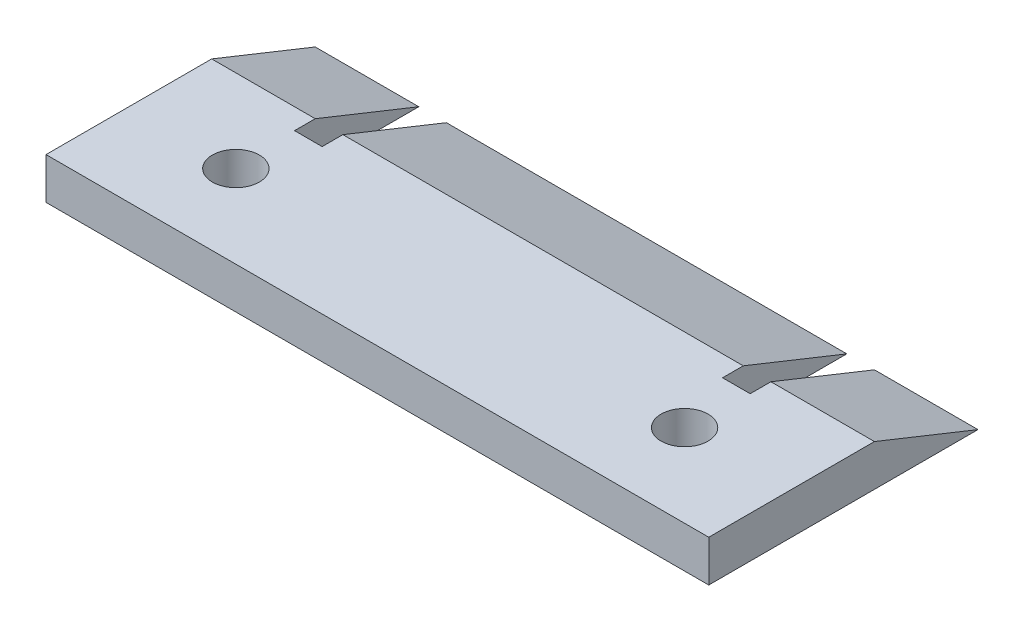
ISO-10303-21;
HEADER;
FILE_DESCRIPTION(('STEP AP214'),'2;1');
FILE_NAME('part.step','',(''),(''),'','','');
FILE_SCHEMA(('AUTOMOTIVE_DESIGN { 1 0 10303 214 1 1 1 1 }'));
ENDSEC;
DATA;
#1=APPLICATION_CONTEXT('core data for automotive mechanical design processes');
#2=APPLICATION_PROTOCOL_DEFINITION('international standard','automotive_design',2000,#1);
#3=PRODUCT_CONTEXT('',#1,'mechanical');
#4=PRODUCT('Part','Part','',(#3));
#5=PRODUCT_RELATED_PRODUCT_CATEGORY('part','',(#4));
#6=PRODUCT_DEFINITION_FORMATION('','',#4);
#7=PRODUCT_DEFINITION_CONTEXT('part definition',#1,'design');
#8=PRODUCT_DEFINITION('design','',#6,#7);
#9=PRODUCT_DEFINITION_SHAPE('','',#8);
#10=(LENGTH_UNIT() NAMED_UNIT(*) SI_UNIT(.MILLI.,.METRE.));
#11=(NAMED_UNIT(*) PLANE_ANGLE_UNIT() SI_UNIT($,.RADIAN.));
#12=(NAMED_UNIT(*) SI_UNIT($,.STERADIAN.) SOLID_ANGLE_UNIT());
#13=UNCERTAINTY_MEASURE_WITH_UNIT(LENGTH_MEASURE(1.E-05),#10,'distance_accuracy_value','');
#14=(GEOMETRIC_REPRESENTATION_CONTEXT(3) GLOBAL_UNCERTAINTY_ASSIGNED_CONTEXT((#13)) GLOBAL_UNIT_ASSIGNED_CONTEXT((#10,
#11,#12)) REPRESENTATION_CONTEXT('',''));
#15=CARTESIAN_POINT('',(0.,0.,0.));
#16=DIRECTION('',(0.,0.,1.));
#17=DIRECTION('',(1.,0.,0.));
#18=AXIS2_PLACEMENT_3D('',#15,#16,#17);
#19=CARTESIAN_POINT('',(48.,6.,0.));
#20=DIRECTION('',(0.,1.,0.));
#21=DIRECTION('',(0.,0.,1.));
#22=AXIS2_PLACEMENT_3D('',#19,#20,#21);
#23=PLANE('',#22);
#24=CARTESIAN_POINT('',(32.5,6.,-12.));
#25=DIRECTION('',(0.,1.,0.));
#26=DIRECTION('',(0.,0.,1.));
#27=AXIS2_PLACEMENT_3D('',#24,#25,#26);
#28=CIRCLE('',#27,3.39999999999999);
#29=CARTESIAN_POINT('',(32.5,6.,-8.60000000000001));
#30=VERTEX_POINT('',#29);
#31=EDGE_CURVE('E191',#30,#30,#28,.T.);
#32=ORIENTED_EDGE('',*,*,#31,.F.);
#33=EDGE_LOOP('',(#32));
#34=FACE_BOUND('',#33,.T.);
#35=CARTESIAN_POINT('',(-32.5,6.,-12.));
#36=DIRECTION('',(0.,1.,0.));
#37=DIRECTION('',(0.,0.,1.));
#38=AXIS2_PLACEMENT_3D('',#35,#36,#37);
#39=CIRCLE('',#38,3.39999999999999);
#40=CARTESIAN_POINT('',(-32.5,6.,-8.60000000000001));
#41=VERTEX_POINT('',#40);
#42=EDGE_CURVE('E197',#41,#41,#39,.T.);
#43=ORIENTED_EDGE('',*,*,#42,.F.);
#44=EDGE_LOOP('',(#43));
#45=FACE_BOUND('',#44,.T.);
#46=DIRECTION('',(1.,0.,0.));
#47=VECTOR('',#46,1.);
#48=CARTESIAN_POINT('',(48.,6.,-21.));
#49=LINE('',#48,#47);
#50=CARTESIAN_POINT('',(28.9999999999999,6.,-21.));
#51=VERTEX_POINT('',#50);
#52=CARTESIAN_POINT('',(32.9999999999999,6.,-21.));
#53=VERTEX_POINT('',#52);
#54=EDGE_CURVE('E169',#51,#53,#49,.T.);
#55=ORIENTED_EDGE('',*,*,#54,.F.);
#56=DIRECTION('',(0.,0.,-1.));
#57=VECTOR('',#56,1.);
#58=CARTESIAN_POINT('',(28.9999999999999,6.,0.));
#59=LINE('',#58,#57);
#60=CARTESIAN_POINT('',(28.9999999999999,6.,-24.));
#61=VERTEX_POINT('',#60);
#62=EDGE_CURVE('E146',#51,#61,#59,.T.);
#63=ORIENTED_EDGE('',*,*,#62,.T.);
#64=DIRECTION('',(-1.,0.,0.));
#65=VECTOR('',#64,1.);
#66=CARTESIAN_POINT('',(48.,6.,-24.));
#67=LINE('',#66,#65);
#68=CARTESIAN_POINT('',(-28.9999999999999,6.,-24.));
#69=VERTEX_POINT('',#68);
#70=EDGE_CURVE('E230',#61,#69,#67,.T.);
#71=ORIENTED_EDGE('',*,*,#70,.T.);
#72=DIRECTION('',(0.,0.,-1.));
#73=VECTOR('',#72,1.);
#74=CARTESIAN_POINT('',(-28.9999999999999,6.,0.));
#75=LINE('',#74,#73);
#76=CARTESIAN_POINT('',(-28.9999999999999,6.,-21.));
#77=VERTEX_POINT('',#76);
#78=EDGE_CURVE('E185',#77,#69,#75,.T.);
#79=ORIENTED_EDGE('',*,*,#78,.F.);
#80=DIRECTION('',(-1.,0.,0.));
#81=VECTOR('',#80,1.);
#82=CARTESIAN_POINT('',(48.,6.,-21.));
#83=LINE('',#82,#81);
#84=CARTESIAN_POINT('',(-32.9999999999999,6.,-21.));
#85=VERTEX_POINT('',#84);
#86=EDGE_CURVE('E188',#77,#85,#83,.T.);
#87=ORIENTED_EDGE('',*,*,#86,.T.);
#88=DIRECTION('',(0.,0.,-1.));
#89=VECTOR('',#88,1.);
#90=CARTESIAN_POINT('',(-32.9999999999999,6.,0.));
#91=LINE('',#90,#89);
#92=CARTESIAN_POINT('',(-32.9999999999999,6.,-24.));
#93=VERTEX_POINT('',#92);
#94=EDGE_CURVE('E180',#85,#93,#91,.T.);
#95=ORIENTED_EDGE('',*,*,#94,.T.);
#96=CARTESIAN_POINT('',(-48.,6.,-24.));
#97=VERTEX_POINT('',#96);
#98=EDGE_CURVE('E215',#93,#97,#67,.T.);
#99=ORIENTED_EDGE('',*,*,#98,.T.);
#100=DIRECTION('',(0.,0.,-1.));
#101=VECTOR('',#100,1.);
#102=CARTESIAN_POINT('',(-48.,6.,0.));
#103=LINE('',#102,#101);
#104=CARTESIAN_POINT('',(-48.,6.,0.));
#105=VERTEX_POINT('',#104);
#106=EDGE_CURVE('E203',#105,#97,#103,.T.);
#107=ORIENTED_EDGE('',*,*,#106,.F.);
#108=DIRECTION('',(-1.,0.,0.));
#109=VECTOR('',#108,1.);
#110=CARTESIAN_POINT('',(48.,6.,0.));
#111=LINE('',#110,#109);
#112=CARTESIAN_POINT('',(48.,6.,0.));
#113=VERTEX_POINT('',#112);
#114=EDGE_CURVE('E236',#113,#105,#111,.T.);
#115=ORIENTED_EDGE('',*,*,#114,.F.);
#116=DIRECTION('',(0.,0.,-1.));
#117=VECTOR('',#116,1.);
#118=CARTESIAN_POINT('',(48.,6.,0.));
#119=LINE('',#118,#117);
#120=CARTESIAN_POINT('',(48.,6.,-24.));
#121=VERTEX_POINT('',#120);
#122=EDGE_CURVE('E204',#113,#121,#119,.T.);
#123=ORIENTED_EDGE('',*,*,#122,.T.);
#124=CARTESIAN_POINT('',(32.9999999999999,6.,-24.));
#125=VERTEX_POINT('',#124);
#126=EDGE_CURVE('E226',#121,#125,#67,.T.);
#127=ORIENTED_EDGE('',*,*,#126,.T.);
#128=DIRECTION('',(0.,0.,-1.));
#129=VECTOR('',#128,1.);
#130=CARTESIAN_POINT('',(32.9999999999999,6.,0.));
#131=LINE('',#130,#129);
#132=EDGE_CURVE('E65',#53,#125,#131,.T.);
#133=ORIENTED_EDGE('',*,*,#132,.F.);
#134=EDGE_LOOP('',(#55,#63,#71,#79,#87,#95,#99,#107,#115,#123,#127,#133));
#135=FACE_BOUND('',#134,.T.);
#136=ADVANCED_FACE('F51',(#34,#45,#135),#23,.T.);
#137=CARTESIAN_POINT('',(48.,0.,0.));
#138=DIRECTION('',(0.,1.,0.));
#139=DIRECTION('',(0.,0.,1.));
#140=AXIS2_PLACEMENT_3D('',#137,#138,#139);
#141=PLANE('',#140);
#142=CARTESIAN_POINT('',(-32.5,0.,-12.));
#143=DIRECTION('',(0.,1.,0.));
#144=DIRECTION('',(0.,0.,1.));
#145=AXIS2_PLACEMENT_3D('',#142,#143,#144);
#146=CIRCLE('',#145,3.4);
#147=CARTESIAN_POINT('',(-32.5,0.,-8.6));
#148=VERTEX_POINT('',#147);
#149=EDGE_CURVE('E200',#148,#148,#146,.T.);
#150=ORIENTED_EDGE('',*,*,#149,.T.);
#151=EDGE_LOOP('',(#150));
#152=FACE_BOUND('',#151,.T.);
#153=CARTESIAN_POINT('',(32.5,0.,-12.));
#154=DIRECTION('',(0.,1.,0.));
#155=DIRECTION('',(0.,0.,1.));
#156=AXIS2_PLACEMENT_3D('',#153,#154,#155);
#157=CIRCLE('',#156,3.4);
#158=CARTESIAN_POINT('',(32.5,0.,-8.6));
#159=VERTEX_POINT('',#158);
#160=EDGE_CURVE('E194',#159,#159,#157,.T.);
#161=ORIENTED_EDGE('',*,*,#160,.T.);
#162=EDGE_LOOP('',(#161));
#163=FACE_BOUND('',#162,.T.);
#164=DIRECTION('',(0.,0.,-1.));
#165=VECTOR('',#164,1.);
#166=CARTESIAN_POINT('',(28.9999999999999,0.,-21.));
#167=LINE('',#166,#165);
#168=CARTESIAN_POINT('',(28.9999999999999,0.,-21.));
#169=VERTEX_POINT('',#168);
#170=CARTESIAN_POINT('',(28.9999999999999,0.,-39.));
#171=VERTEX_POINT('',#170);
#172=EDGE_CURVE('E143',#169,#171,#167,.T.);
#173=ORIENTED_EDGE('',*,*,#172,.F.);
#174=DIRECTION('',(1.,0.,0.));
#175=VECTOR('',#174,1.);
#176=CARTESIAN_POINT('',(28.9999999999999,0.,-21.));
#177=LINE('',#176,#175);
#178=CARTESIAN_POINT('',(32.9999999999999,0.,-21.));
#179=VERTEX_POINT('',#178);
#180=EDGE_CURVE('E153',#169,#179,#177,.T.);
#181=ORIENTED_EDGE('',*,*,#180,.T.);
#182=DIRECTION('',(0.,0.,-1.));
#183=VECTOR('',#182,1.);
#184=CARTESIAN_POINT('',(32.9999999999999,0.,-21.));
#185=LINE('',#184,#183);
#186=CARTESIAN_POINT('',(32.9999999999999,0.,-39.));
#187=VERTEX_POINT('',#186);
#188=EDGE_CURVE('E150',#179,#187,#185,.T.);
#189=ORIENTED_EDGE('',*,*,#188,.T.);
#190=DIRECTION('',(-1.,0.,0.));
#191=VECTOR('',#190,1.);
#192=CARTESIAN_POINT('',(48.,0.,-39.));
#193=LINE('',#192,#191);
#194=CARTESIAN_POINT('',(48.,0.,-39.));
#195=VERTEX_POINT('',#194);
#196=EDGE_CURVE('E231',#195,#187,#193,.T.);
#197=ORIENTED_EDGE('',*,*,#196,.F.);
#198=DIRECTION('',(0.,0.,-1.));
#199=VECTOR('',#198,1.);
#200=CARTESIAN_POINT('',(48.,0.,0.));
#201=LINE('',#200,#199);
#202=CARTESIAN_POINT('',(48.,0.,0.));
#203=VERTEX_POINT('',#202);
#204=EDGE_CURVE('E211',#203,#195,#201,.T.);
#205=ORIENTED_EDGE('',*,*,#204,.F.);
#206=DIRECTION('',(-1.,0.,0.));
#207=VECTOR('',#206,1.);
#208=CARTESIAN_POINT('',(48.,0.,0.));
#209=LINE('',#208,#207);
#210=CARTESIAN_POINT('',(-48.,0.,0.));
#211=VERTEX_POINT('',#210);
#212=EDGE_CURVE('E234',#203,#211,#209,.T.);
#213=ORIENTED_EDGE('',*,*,#212,.T.);
#214=DIRECTION('',(0.,0.,-1.));
#215=VECTOR('',#214,1.);
#216=CARTESIAN_POINT('',(-48.,0.,0.));
#217=LINE('',#216,#215);
#218=CARTESIAN_POINT('',(-48.,0.,-39.));
#219=VERTEX_POINT('',#218);
#220=EDGE_CURVE('E221',#211,#219,#217,.T.);
#221=ORIENTED_EDGE('',*,*,#220,.T.);
#222=CARTESIAN_POINT('',(-32.9999999999999,0.,-39.));
#223=VERTEX_POINT('',#222);
#224=EDGE_CURVE('E229',#223,#219,#193,.T.);
#225=ORIENTED_EDGE('',*,*,#224,.F.);
#226=DIRECTION('',(0.,0.,-1.));
#227=VECTOR('',#226,1.);
#228=CARTESIAN_POINT('',(-32.9999999999999,0.,-21.));
#229=LINE('',#228,#227);
#230=CARTESIAN_POINT('',(-32.9999999999999,0.,-21.));
#231=VERTEX_POINT('',#230);
#232=EDGE_CURVE('E73',#231,#223,#229,.T.);
#233=ORIENTED_EDGE('',*,*,#232,.F.);
#234=DIRECTION('',(-1.,0.,0.));
#235=VECTOR('',#234,1.);
#236=CARTESIAN_POINT('',(-28.9999999999999,0.,-21.));
#237=LINE('',#236,#235);
#238=CARTESIAN_POINT('',(-28.9999999999999,0.,-21.));
#239=VERTEX_POINT('',#238);
#240=EDGE_CURVE('E174',#239,#231,#237,.T.);
#241=ORIENTED_EDGE('',*,*,#240,.F.);
#242=DIRECTION('',(0.,0.,-1.));
#243=VECTOR('',#242,1.);
#244=CARTESIAN_POINT('',(-28.9999999999999,0.,-21.));
#245=LINE('',#244,#243);
#246=CARTESIAN_POINT('',(-28.9999999999999,0.,-39.));
#247=VERTEX_POINT('',#246);
#248=EDGE_CURVE('E171',#239,#247,#245,.T.);
#249=ORIENTED_EDGE('',*,*,#248,.T.);
#250=EDGE_CURVE('E162',#171,#247,#193,.T.);
#251=ORIENTED_EDGE('',*,*,#250,.F.);
#252=EDGE_LOOP('',(#173,#181,#189,#197,#205,#213,#221,#225,#233,#241,#249,#251));
#253=FACE_BOUND('',#252,.T.);
#254=ADVANCED_FACE('F160',(#152,#163,#253),#141,.F.);
#255=CARTESIAN_POINT('',(48.,13.448275862069,-5.37931034482759));
#256=DIRECTION('',(0.,-0.928476690885259,0.371390676354104));
#257=DIRECTION('',(0.,-0.371390676354104,-0.928476690885259));
#258=AXIS2_PLACEMENT_3D('',#255,#256,#257);
#259=PLANE('',#258);
#260=DIRECTION('',(0.,0.371390676354104,0.928476690885259));
#261=VECTOR('',#260,1.);
#262=CARTESIAN_POINT('',(28.9999999999999,13.448275862069,-5.37931034482759));
#263=LINE('',#262,#261);
#264=EDGE_CURVE('E11',#171,#61,#263,.T.);
#265=ORIENTED_EDGE('',*,*,#264,.F.);
#266=ORIENTED_EDGE('',*,*,#250,.T.);
#267=DIRECTION('',(0.,0.371390676354104,0.928476690885259));
#268=VECTOR('',#267,1.);
#269=CARTESIAN_POINT('',(-28.9999999999999,13.448275862069,-5.37931034482759));
#270=LINE('',#269,#268);
#271=EDGE_CURVE('E240',#247,#69,#270,.T.);
#272=ORIENTED_EDGE('',*,*,#271,.T.);
#273=ORIENTED_EDGE('',*,*,#70,.F.);
#274=EDGE_LOOP('',(#265,#266,#272,#273));
#275=FACE_BOUND('',#274,.T.);
#276=ADVANCED_FACE('F274',(#275),#259,.F.);
#277=DIRECTION('',(0.,0.371390676354104,0.928476690885259));
#278=VECTOR('',#277,1.);
#279=CARTESIAN_POINT('',(-32.9999999999999,13.448275862069,-5.37931034482759));
#280=LINE('',#279,#278);
#281=EDGE_CURVE('E238',#223,#93,#280,.T.);
#282=ORIENTED_EDGE('',*,*,#281,.F.);
#283=ORIENTED_EDGE('',*,*,#224,.T.);
#284=DIRECTION('',(0.,0.371390676354104,0.928476690885259));
#285=VECTOR('',#284,1.);
#286=CARTESIAN_POINT('',(-48.,13.448275862069,-5.37931034482759));
#287=LINE('',#286,#285);
#288=EDGE_CURVE('E208',#219,#97,#287,.T.);
#289=ORIENTED_EDGE('',*,*,#288,.T.);
#290=ORIENTED_EDGE('',*,*,#98,.F.);
#291=EDGE_LOOP('',(#282,#283,#289,#290));
#292=FACE_BOUND('',#291,.T.);
#293=ADVANCED_FACE('F303',(#292),#259,.F.);
#294=CARTESIAN_POINT('',(48.,0.,0.));
#295=DIRECTION('',(0.,0.,1.));
#296=DIRECTION('',(1.,0.,0.));
#297=AXIS2_PLACEMENT_3D('',#294,#295,#296);
#298=PLANE('',#297);
#299=DIRECTION('',(0.,1.,0.));
#300=VECTOR('',#299,1.);
#301=CARTESIAN_POINT('',(-48.,0.,0.));
#302=LINE('',#301,#300);
#303=EDGE_CURVE('E218',#211,#105,#302,.T.);
#304=ORIENTED_EDGE('',*,*,#303,.F.);
#305=ORIENTED_EDGE('',*,*,#212,.F.);
#306=DIRECTION('',(0.,1.,0.));
#307=VECTOR('',#306,1.);
#308=CARTESIAN_POINT('',(48.,0.,0.));
#309=LINE('',#308,#307);
#310=EDGE_CURVE('E207',#203,#113,#309,.T.);
#311=ORIENTED_EDGE('',*,*,#310,.T.);
#312=ORIENTED_EDGE('',*,*,#114,.T.);
#313=EDGE_LOOP('',(#304,#305,#311,#312));
#314=FACE_BOUND('',#313,.T.);
#315=ADVANCED_FACE('F255',(#314),#298,.T.);
#316=ORIENTED_EDGE('',*,*,#196,.T.);
#317=DIRECTION('',(0.,0.371390676354104,0.928476690885259));
#318=VECTOR('',#317,1.);
#319=CARTESIAN_POINT('',(32.9999999999999,13.448275862069,-5.37931034482759));
#320=LINE('',#319,#318);
#321=EDGE_CURVE('E58',#187,#125,#320,.T.);
#322=ORIENTED_EDGE('',*,*,#321,.T.);
#323=ORIENTED_EDGE('',*,*,#126,.F.);
#324=DIRECTION('',(0.,0.371390676354104,0.928476690885259));
#325=VECTOR('',#324,1.);
#326=CARTESIAN_POINT('',(48.,13.448275862069,-5.37931034482759));
#327=LINE('',#326,#325);
#328=EDGE_CURVE('E213',#195,#121,#327,.T.);
#329=ORIENTED_EDGE('',*,*,#328,.F.);
#330=EDGE_LOOP('',(#316,#322,#323,#329));
#331=FACE_BOUND('',#330,.T.);
#332=ADVANCED_FACE('F244',(#331),#259,.F.);
#333=CARTESIAN_POINT('',(48.,0.,0.));
#334=DIRECTION('',(1.,0.,0.));
#335=DIRECTION('',(0.,0.,-1.));
#336=AXIS2_PLACEMENT_3D('',#333,#334,#335);
#337=PLANE('',#336);
#338=ORIENTED_EDGE('',*,*,#122,.F.);
#339=ORIENTED_EDGE('',*,*,#310,.F.);
#340=ORIENTED_EDGE('',*,*,#204,.T.);
#341=ORIENTED_EDGE('',*,*,#328,.T.);
#342=EDGE_LOOP('',(#338,#339,#340,#341));
#343=FACE_BOUND('',#342,.T.);
#344=ADVANCED_FACE('F252',(#343),#337,.T.);
#345=CARTESIAN_POINT('',(-48.,0.,0.));
#346=DIRECTION('',(1.,0.,0.));
#347=DIRECTION('',(0.,0.,-1.));
#348=AXIS2_PLACEMENT_3D('',#345,#346,#347);
#349=PLANE('',#348);
#350=ORIENTED_EDGE('',*,*,#106,.T.);
#351=ORIENTED_EDGE('',*,*,#288,.F.);
#352=ORIENTED_EDGE('',*,*,#220,.F.);
#353=ORIENTED_EDGE('',*,*,#303,.T.);
#354=EDGE_LOOP('',(#350,#351,#352,#353));
#355=FACE_BOUND('',#354,.T.);
#356=ADVANCED_FACE('F284',(#355),#349,.F.);
#357=CARTESIAN_POINT('',(-32.5,6.,-12.));
#358=DIRECTION('',(0.,1.,0.));
#359=DIRECTION('',(0.,0.,1.));
#360=AXIS2_PLACEMENT_3D('',#357,#358,#359);
#361=CYLINDRICAL_SURFACE('',#360,3.39999999999999);
#362=ORIENTED_EDGE('',*,*,#149,.F.);
#363=EDGE_LOOP('',(#362));
#364=FACE_BOUND('',#363,.T.);
#365=ORIENTED_EDGE('',*,*,#42,.T.);
#366=EDGE_LOOP('',(#365));
#367=FACE_BOUND('',#366,.T.);
#368=ADVANCED_FACE('F281',(#364,#367),#361,.F.);
#369=CARTESIAN_POINT('',(32.5,6.,-12.));
#370=DIRECTION('',(0.,1.,0.));
#371=DIRECTION('',(0.,0.,1.));
#372=AXIS2_PLACEMENT_3D('',#369,#370,#371);
#373=CYLINDRICAL_SURFACE('',#372,3.39999999999999);
#374=ORIENTED_EDGE('',*,*,#160,.F.);
#375=EDGE_LOOP('',(#374));
#376=FACE_BOUND('',#375,.T.);
#377=ORIENTED_EDGE('',*,*,#31,.T.);
#378=EDGE_LOOP('',(#377));
#379=FACE_BOUND('',#378,.T.);
#380=ADVANCED_FACE('F283',(#376,#379),#373,.F.);
#381=CARTESIAN_POINT('',(-28.9999999999999,0.,-21.));
#382=DIRECTION('',(1.,0.,0.));
#383=DIRECTION('',(0.,0.,-1.));
#384=AXIS2_PLACEMENT_3D('',#381,#382,#383);
#385=PLANE('',#384);
#386=ORIENTED_EDGE('',*,*,#78,.T.);
#387=ORIENTED_EDGE('',*,*,#271,.F.);
#388=ORIENTED_EDGE('',*,*,#248,.F.);
#389=DIRECTION('',(0.,1.,0.));
#390=VECTOR('',#389,1.);
#391=CARTESIAN_POINT('',(-28.9999999999999,0.,-21.));
#392=LINE('',#391,#390);
#393=EDGE_CURVE('E177',#239,#77,#392,.T.);
#394=ORIENTED_EDGE('',*,*,#393,.T.);
#395=EDGE_LOOP('',(#386,#387,#388,#394));
#396=FACE_BOUND('',#395,.T.);
#397=ADVANCED_FACE('F291',(#396),#385,.F.);
#398=CARTESIAN_POINT('',(-28.9999999999999,0.,-21.));
#399=DIRECTION('',(0.,0.,-1.));
#400=DIRECTION('',(-1.,0.,0.));
#401=AXIS2_PLACEMENT_3D('',#398,#399,#400);
#402=PLANE('',#401);
#403=ORIENTED_EDGE('',*,*,#393,.F.);
#404=ORIENTED_EDGE('',*,*,#240,.T.);
#405=DIRECTION('',(0.,1.,0.));
#406=VECTOR('',#405,1.);
#407=CARTESIAN_POINT('',(-32.9999999999999,0.,-21.));
#408=LINE('',#407,#406);
#409=EDGE_CURVE('E176',#231,#85,#408,.T.);
#410=ORIENTED_EDGE('',*,*,#409,.T.);
#411=ORIENTED_EDGE('',*,*,#86,.F.);
#412=EDGE_LOOP('',(#403,#404,#410,#411));
#413=FACE_BOUND('',#412,.T.);
#414=ADVANCED_FACE('F325',(#413),#402,.T.);
#415=CARTESIAN_POINT('',(-32.9999999999999,0.,-21.));
#416=DIRECTION('',(1.,0.,0.));
#417=DIRECTION('',(0.,0.,-1.));
#418=AXIS2_PLACEMENT_3D('',#415,#416,#417);
#419=PLANE('',#418);
#420=ORIENTED_EDGE('',*,*,#409,.F.);
#421=ORIENTED_EDGE('',*,*,#232,.T.);
#422=ORIENTED_EDGE('',*,*,#281,.T.);
#423=ORIENTED_EDGE('',*,*,#94,.F.);
#424=EDGE_LOOP('',(#420,#421,#422,#423));
#425=FACE_BOUND('',#424,.T.);
#426=ADVANCED_FACE('F266',(#425),#419,.T.);
#427=CARTESIAN_POINT('',(28.9999999999999,0.,-21.));
#428=DIRECTION('',(1.,0.,0.));
#429=DIRECTION('',(0.,0.,-1.));
#430=AXIS2_PLACEMENT_3D('',#427,#428,#429);
#431=PLANE('',#430);
#432=DIRECTION('',(0.,1.,0.));
#433=VECTOR('',#432,1.);
#434=CARTESIAN_POINT('',(28.9999999999999,0.,-21.));
#435=LINE('',#434,#433);
#436=EDGE_CURVE('E139',#169,#51,#435,.T.);
#437=ORIENTED_EDGE('',*,*,#436,.F.);
#438=ORIENTED_EDGE('',*,*,#172,.T.);
#439=ORIENTED_EDGE('',*,*,#264,.T.);
#440=ORIENTED_EDGE('',*,*,#62,.F.);
#441=EDGE_LOOP('',(#437,#438,#439,#440));
#442=FACE_BOUND('',#441,.T.);
#443=ADVANCED_FACE('F141',(#442),#431,.T.);
#444=CARTESIAN_POINT('',(32.9999999999999,0.,-21.));
#445=DIRECTION('',(1.,0.,0.));
#446=DIRECTION('',(0.,0.,-1.));
#447=AXIS2_PLACEMENT_3D('',#444,#445,#446);
#448=PLANE('',#447);
#449=ORIENTED_EDGE('',*,*,#132,.T.);
#450=ORIENTED_EDGE('',*,*,#321,.F.);
#451=ORIENTED_EDGE('',*,*,#188,.F.);
#452=DIRECTION('',(0.,1.,0.));
#453=VECTOR('',#452,1.);
#454=CARTESIAN_POINT('',(32.9999999999999,0.,-21.));
#455=LINE('',#454,#453);
#456=EDGE_CURVE('E149',#179,#53,#455,.T.);
#457=ORIENTED_EDGE('',*,*,#456,.T.);
#458=EDGE_LOOP('',(#449,#450,#451,#457));
#459=FACE_BOUND('',#458,.T.);
#460=ADVANCED_FACE('F258',(#459),#448,.F.);
#461=CARTESIAN_POINT('',(28.9999999999999,0.,-21.));
#462=DIRECTION('',(0.,0.,1.));
#463=DIRECTION('',(1.,0.,0.));
#464=AXIS2_PLACEMENT_3D('',#461,#462,#463);
#465=PLANE('',#464);
#466=ORIENTED_EDGE('',*,*,#54,.T.);
#467=ORIENTED_EDGE('',*,*,#456,.F.);
#468=ORIENTED_EDGE('',*,*,#180,.F.);
#469=ORIENTED_EDGE('',*,*,#436,.T.);
#470=EDGE_LOOP('',(#466,#467,#468,#469));
#471=FACE_BOUND('',#470,.T.);
#472=ADVANCED_FACE('F154',(#471),#465,.F.);
#473=CLOSED_SHELL('',(#136,#254,#276,#293,#315,#332,#344,#356,#368,#380,#397,#414,#426,#443,
#460,#472));
#474=MANIFOLD_SOLID_BREP('B2',#473);
#475=ADVANCED_BREP_SHAPE_REPRESENTATION('',(#18,#474),#14);
#476=SHAPE_DEFINITION_REPRESENTATION(#9,#475);
ENDSEC;
END-ISO-10303-21;
